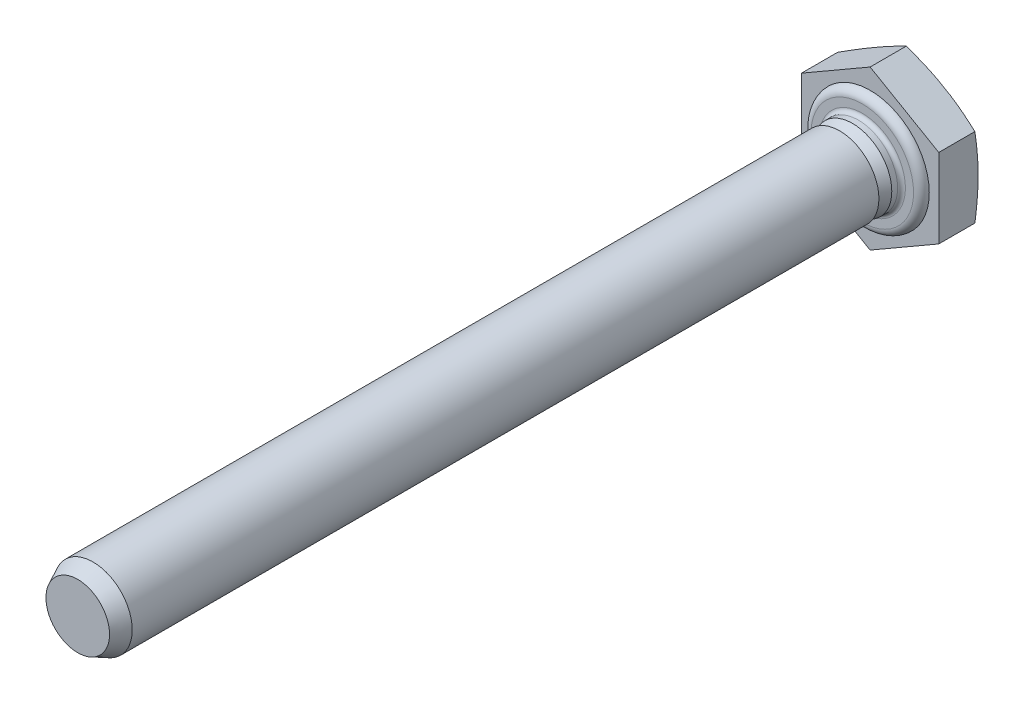
ISO-10303-21;
HEADER;
FILE_DESCRIPTION(('STEP AP214'),'2;1');
FILE_NAME('part.step','',(''),(''),'','','');
FILE_SCHEMA(('AUTOMOTIVE_DESIGN { 1 0 10303 214 1 1 1 1 }'));
ENDSEC;
DATA;
#1=APPLICATION_CONTEXT('core data for automotive mechanical design processes');
#2=APPLICATION_PROTOCOL_DEFINITION('international standard','automotive_design',2000,#1);
#3=PRODUCT_CONTEXT('',#1,'mechanical');
#4=PRODUCT('Part','Part','',(#3));
#5=PRODUCT_RELATED_PRODUCT_CATEGORY('part','',(#4));
#6=PRODUCT_DEFINITION_FORMATION('','',#4);
#7=PRODUCT_DEFINITION_CONTEXT('part definition',#1,'design');
#8=PRODUCT_DEFINITION('design','',#6,#7);
#9=PRODUCT_DEFINITION_SHAPE('','',#8);
#10=(LENGTH_UNIT() NAMED_UNIT(*) SI_UNIT(.MILLI.,.METRE.));
#11=(NAMED_UNIT(*) PLANE_ANGLE_UNIT() SI_UNIT($,.RADIAN.));
#12=(NAMED_UNIT(*) SI_UNIT($,.STERADIAN.) SOLID_ANGLE_UNIT());
#13=UNCERTAINTY_MEASURE_WITH_UNIT(LENGTH_MEASURE(1.E-05),#10,'distance_accuracy_value','');
#14=(GEOMETRIC_REPRESENTATION_CONTEXT(3) GLOBAL_UNCERTAINTY_ASSIGNED_CONTEXT((#13)) GLOBAL_UNIT_ASSIGNED_CONTEXT((#10,
#11,#12)) REPRESENTATION_CONTEXT('',''));
#15=CARTESIAN_POINT('',(0.,0.,0.));
#16=DIRECTION('',(0.,0.,1.));
#17=DIRECTION('',(1.,0.,0.));
#18=AXIS2_PLACEMENT_3D('',#15,#16,#17);
#19=CARTESIAN_POINT('',(0.,-1.621125,40.));
#20=DIRECTION('',(0.,0.,1.));
#21=DIRECTION('',(-1.,0.,0.));
#22=AXIS2_PLACEMENT_3D('',#19,#20,#21);
#23=PLANE('',#22);
#24=CARTESIAN_POINT('',(0.,0.,40.));
#25=DIRECTION('',(0.,0.,-1.));
#26=DIRECTION('',(1.,0.,0.));
#27=AXIS2_PLACEMENT_3D('',#24,#25,#26);
#28=CIRCLE('',#27,1.621125);
#29=CARTESIAN_POINT('',(1.621125,0.,40.));
#30=VERTEX_POINT('',#29);
#31=EDGE_CURVE('E9',#30,#30,#28,.T.);
#32=ORIENTED_EDGE('',*,*,#31,.F.);
#33=EDGE_LOOP('',(#32));
#34=FACE_BOUND('',#33,.T.);
#35=ADVANCED_FACE('F15',(#34),#23,.T.);
#36=CARTESIAN_POINT('',(0.,0.,39.221125));
#37=DIRECTION('',(0.,0.,-1.));
#38=DIRECTION('',(1.,0.,0.));
#39=AXIS2_PLACEMENT_3D('',#36,#37,#38);
#40=CONICAL_SURFACE('',#39,2.,0.452739889546849);
#41=ORIENTED_EDGE('',*,*,#31,.T.);
#42=EDGE_LOOP('',(#41));
#43=FACE_BOUND('',#42,.T.);
#44=CARTESIAN_POINT('',(0.,0.,39.221125));
#45=DIRECTION('',(0.,0.,-1.));
#46=DIRECTION('',(1.,0.,0.));
#47=AXIS2_PLACEMENT_3D('',#44,#45,#46);
#48=CIRCLE('',#47,2.);
#49=CARTESIAN_POINT('',(2.,0.,39.221125));
#50=VERTEX_POINT('',#49);
#51=EDGE_CURVE('E23',#50,#50,#48,.T.);
#52=ORIENTED_EDGE('',*,*,#51,.F.);
#53=EDGE_LOOP('',(#52));
#54=FACE_BOUND('',#53,.T.);
#55=ADVANCED_FACE('F239',(#43,#54),#40,.T.);
#56=CARTESIAN_POINT('',(0.,0.,-0.4));
#57=DIRECTION('',(0.,0.,-1.));
#58=DIRECTION('',(1.,0.,0.));
#59=AXIS2_PLACEMENT_3D('',#56,#57,#58);
#60=CYLINDRICAL_SURFACE('',#59,2.);
#61=ORIENTED_EDGE('',*,*,#51,.T.);
#62=EDGE_LOOP('',(#61));
#63=FACE_BOUND('',#62,.T.);
#64=CARTESIAN_POINT('',(0.,0.,1.152));
#65=DIRECTION('',(0.,0.,-1.));
#66=DIRECTION('',(1.,0.,0.));
#67=AXIS2_PLACEMENT_3D('',#64,#65,#66);
#68=CIRCLE('',#67,2.);
#69=CARTESIAN_POINT('',(2.,0.,1.152));
#70=VERTEX_POINT('',#69);
#71=EDGE_CURVE('E227',#70,#70,#68,.T.);
#72=ORIENTED_EDGE('',*,*,#71,.F.);
#73=EDGE_LOOP('',(#72));
#74=FACE_BOUND('',#73,.T.);
#75=ADVANCED_FACE('F236',(#63,#74),#60,.T.);
#76=CARTESIAN_POINT('',(0.,-1.621125,1.152));
#77=DIRECTION('',(0.,0.,-1.));
#78=DIRECTION('',(1.,0.,0.));
#79=AXIS2_PLACEMENT_3D('',#76,#77,#78);
#80=PLANE('',#79);
#81=ORIENTED_EDGE('',*,*,#71,.T.);
#82=EDGE_LOOP('',(#81));
#83=FACE_BOUND('',#82,.T.);
#84=CARTESIAN_POINT('',(0.,0.,1.152));
#85=DIRECTION('',(0.,0.,-1.));
#86=DIRECTION('',(1.,0.,0.));
#87=AXIS2_PLACEMENT_3D('',#84,#85,#86);
#88=CIRCLE('',#87,1.621125);
#89=CARTESIAN_POINT('',(1.621125,0.,1.152));
#90=VERTEX_POINT('',#89);
#91=EDGE_CURVE('E223',#90,#90,#88,.T.);
#92=ORIENTED_EDGE('',*,*,#91,.F.);
#93=EDGE_LOOP('',(#92));
#94=FACE_BOUND('',#93,.T.);
#95=ADVANCED_FACE('F247',(#83,#94),#80,.T.);
#96=CARTESIAN_POINT('',(0.,0.,0.495769250282342));
#97=DIRECTION('',(0.,0.,-1.));
#98=DIRECTION('',(1.,0.,0.));
#99=AXIS2_PLACEMENT_3D('',#96,#97,#98);
#100=CONICAL_SURFACE('',#99,2.,0.523598775598299);
#101=ORIENTED_EDGE('',*,*,#91,.T.);
#102=EDGE_LOOP('',(#101));
#103=FACE_BOUND('',#102,.T.);
#104=CARTESIAN_POINT('',(0.,0.,0.495769250282342));
#105=DIRECTION('',(0.,0.,-1.));
#106=DIRECTION('',(1.,0.,0.));
#107=AXIS2_PLACEMENT_3D('',#104,#105,#106);
#108=CIRCLE('',#107,2.);
#109=CARTESIAN_POINT('',(2.,0.,0.495769250282342));
#110=VERTEX_POINT('',#109);
#111=EDGE_CURVE('E219',#110,#110,#108,.T.);
#112=ORIENTED_EDGE('',*,*,#111,.F.);
#113=EDGE_LOOP('',(#112));
#114=FACE_BOUND('',#113,.T.);
#115=ADVANCED_FACE('F253',(#103,#114),#100,.T.);
#116=CARTESIAN_POINT('',(0.,0.,-0.4));
#117=DIRECTION('',(0.,0.,-1.));
#118=DIRECTION('',(1.,0.,0.));
#119=AXIS2_PLACEMENT_3D('',#116,#117,#118);
#120=CYLINDRICAL_SURFACE('',#119,2.);
#121=ORIENTED_EDGE('',*,*,#111,.T.);
#122=EDGE_LOOP('',(#121));
#123=FACE_BOUND('',#122,.T.);
#124=CARTESIAN_POINT('',(0.,0.,0.2));
#125=DIRECTION('',(0.,0.,-1.));
#126=DIRECTION('',(1.,0.,0.));
#127=AXIS2_PLACEMENT_3D('',#124,#125,#126);
#128=CIRCLE('',#127,2.);
#129=CARTESIAN_POINT('',(2.,0.,0.2));
#130=VERTEX_POINT('',#129);
#131=EDGE_CURVE('E215',#130,#130,#128,.T.);
#132=ORIENTED_EDGE('',*,*,#131,.F.);
#133=EDGE_LOOP('',(#132));
#134=FACE_BOUND('',#133,.T.);
#135=ADVANCED_FACE('F257',(#123,#134),#120,.T.);
#136=CARTESIAN_POINT('',(0.,0.,0.2));
#137=DIRECTION('',(0.,0.,-1.));
#138=DIRECTION('',(1.,0.,0.));
#139=AXIS2_PLACEMENT_3D('',#136,#137,#138);
#140=TOROIDAL_SURFACE('',#139,2.2,0.2);
#141=ORIENTED_EDGE('',*,*,#131,.T.);
#142=EDGE_LOOP('',(#141));
#143=FACE_BOUND('',#142,.T.);
#144=CARTESIAN_POINT('',(0.,0.,0.));
#145=DIRECTION('',(0.,0.,-1.));
#146=DIRECTION('',(1.,0.,0.));
#147=AXIS2_PLACEMENT_3D('',#144,#145,#146);
#148=CIRCLE('',#147,2.2);
#149=CARTESIAN_POINT('',(2.2,0.,0.));
#150=VERTEX_POINT('',#149);
#151=EDGE_CURVE('E211',#150,#150,#148,.T.);
#152=ORIENTED_EDGE('',*,*,#151,.F.);
#153=EDGE_LOOP('',(#152));
#154=FACE_BOUND('',#153,.T.);
#155=ADVANCED_FACE('F261',(#143,#154),#140,.F.);
#156=CARTESIAN_POINT('',(0.,-2.615,0.));
#157=DIRECTION('',(0.,0.,1.));
#158=DIRECTION('',(-1.,0.,0.));
#159=AXIS2_PLACEMENT_3D('',#156,#157,#158);
#160=PLANE('',#159);
#161=ORIENTED_EDGE('',*,*,#151,.T.);
#162=EDGE_LOOP('',(#161));
#163=FACE_BOUND('',#162,.T.);
#164=CARTESIAN_POINT('',(0.,0.,0.));
#165=DIRECTION('',(0.,0.,-1.));
#166=DIRECTION('',(1.,0.,0.));
#167=AXIS2_PLACEMENT_3D('',#164,#165,#166);
#168=CIRCLE('',#167,2.615);
#169=CARTESIAN_POINT('',(2.615,0.,0.));
#170=VERTEX_POINT('',#169);
#171=EDGE_CURVE('E207',#170,#170,#168,.T.);
#172=ORIENTED_EDGE('',*,*,#171,.F.);
#173=EDGE_LOOP('',(#172));
#174=FACE_BOUND('',#173,.T.);
#175=ADVANCED_FACE('F265',(#163,#174),#160,.T.);
#176=CARTESIAN_POINT('',(0.,0.,-0.4));
#177=DIRECTION('',(0.,0.,-1.));
#178=DIRECTION('',(1.,0.,0.));
#179=AXIS2_PLACEMENT_3D('',#176,#177,#178);
#180=TOROIDAL_SURFACE('',#179,2.615,0.4);
#181=CARTESIAN_POINT('',(0.,0.,-0.4));
#182=DIRECTION('',(0.,0.,-1.));
#183=DIRECTION('',(1.,0.,0.));
#184=AXIS2_PLACEMENT_3D('',#181,#182,#183);
#185=CIRCLE('',#184,3.015);
#186=CARTESIAN_POINT('',(3.015,0.,-0.4));
#187=VERTEX_POINT('',#186);
#188=EDGE_CURVE('E203',#187,#187,#185,.T.);
#189=ORIENTED_EDGE('',*,*,#188,.F.);
#190=EDGE_LOOP('',(#189));
#191=FACE_BOUND('',#190,.T.);
#192=ORIENTED_EDGE('',*,*,#171,.T.);
#193=EDGE_LOOP('',(#192));
#194=FACE_BOUND('',#193,.T.);
#195=ADVANCED_FACE('F269',(#191,#194),#180,.T.);
#196=CARTESIAN_POINT('',(-3.5,-2.02125,-0.4));
#197=DIRECTION('',(0.,0.,1.));
#198=DIRECTION('',(-1.,0.,0.));
#199=AXIS2_PLACEMENT_3D('',#196,#197,#198);
#200=PLANE('',#199);
#201=DIRECTION('',(0.,-1.,0.));
#202=VECTOR('',#201,1.);
#203=CARTESIAN_POINT('',(-3.5,2.02125,-0.4));
#204=LINE('',#203,#202);
#205=CARTESIAN_POINT('',(-3.5,2.02125,-0.4));
#206=VERTEX_POINT('',#205);
#207=CARTESIAN_POINT('',(-3.5,-2.02125,-0.4));
#208=VERTEX_POINT('',#207);
#209=EDGE_CURVE('E161',#206,#208,#204,.T.);
#210=ORIENTED_EDGE('',*,*,#209,.T.);
#211=DIRECTION('',(0.865969252911153,-0.500097243556191,0.));
#212=VECTOR('',#211,1.);
#213=CARTESIAN_POINT('',(-3.5,-2.02125,-0.4));
#214=LINE('',#213,#212);
#215=CARTESIAN_POINT('',(0.,-4.0425,-0.4));
#216=VERTEX_POINT('',#215);
#217=EDGE_CURVE('E163',#208,#216,#214,.T.);
#218=ORIENTED_EDGE('',*,*,#217,.T.);
#219=DIRECTION('',(0.865969252911153,0.500097243556191,0.));
#220=VECTOR('',#219,1.);
#221=CARTESIAN_POINT('',(0.,-4.0425,-0.4));
#222=LINE('',#221,#220);
#223=CARTESIAN_POINT('',(3.5,-2.02125,-0.4));
#224=VERTEX_POINT('',#223);
#225=EDGE_CURVE('E166',#216,#224,#222,.T.);
#226=ORIENTED_EDGE('',*,*,#225,.T.);
#227=DIRECTION('',(0.,1.,0.));
#228=VECTOR('',#227,1.);
#229=CARTESIAN_POINT('',(3.5,-2.02125,-0.4));
#230=LINE('',#229,#228);
#231=CARTESIAN_POINT('',(3.5,2.02125,-0.4));
#232=VERTEX_POINT('',#231);
#233=EDGE_CURVE('E169',#224,#232,#230,.T.);
#234=ORIENTED_EDGE('',*,*,#233,.T.);
#235=DIRECTION('',(-0.865969252911153,0.500097243556191,0.));
#236=VECTOR('',#235,1.);
#237=CARTESIAN_POINT('',(3.5,2.02125,-0.4));
#238=LINE('',#237,#236);
#239=CARTESIAN_POINT('',(0.,4.0425,-0.4));
#240=VERTEX_POINT('',#239);
#241=EDGE_CURVE('E172',#232,#240,#238,.T.);
#242=ORIENTED_EDGE('',*,*,#241,.T.);
#243=DIRECTION('',(-0.865969252911153,-0.500097243556191,0.));
#244=VECTOR('',#243,1.);
#245=CARTESIAN_POINT('',(0.,4.0425,-0.4));
#246=LINE('',#245,#244);
#247=EDGE_CURVE('E175',#240,#206,#246,.T.);
#248=ORIENTED_EDGE('',*,*,#247,.T.);
#249=EDGE_LOOP('',(#210,#218,#226,#234,#242,#248));
#250=FACE_BOUND('',#249,.T.);
#251=ORIENTED_EDGE('',*,*,#188,.T.);
#252=EDGE_LOOP('',(#251));
#253=FACE_BOUND('',#252,.T.);
#254=ADVANCED_FACE('F273',(#250,#253),#200,.T.);
#255=CARTESIAN_POINT('',(-3.5,2.02125,-0.4));
#256=DIRECTION('',(1.,0.,0.));
#257=DIRECTION('',(0.,0.,1.));
#258=AXIS2_PLACEMENT_3D('',#255,#256,#257);
#259=PLANE('',#258);
#260=DIRECTION('',(0.,0.,-1.));
#261=VECTOR('',#260,1.);
#262=CARTESIAN_POINT('',(-3.5,2.02125,-0.4));
#263=LINE('',#262,#261);
#264=CARTESIAN_POINT('',(-3.5,2.02125,-2.24006354118505));
#265=VERTEX_POINT('',#264);
#266=EDGE_CURVE('E178',#206,#265,#263,.T.);
#267=ORIENTED_EDGE('',*,*,#266,.T.);
#268=CARTESIAN_POINT('',(-3.5,5.3488604351927,-1.51685516034737));
#269=CARTESIAN_POINT('',(-3.5,5.1901334809816,-1.55771033626342));
#270=CARTESIAN_POINT('',(-3.5,5.03127797574728,-1.59807472901864));
#271=CARTESIAN_POINT('',(-3.5,4.71324571180039,-1.67755433073894));
#272=CARTESIAN_POINT('',(-3.5,4.55406893563082,-1.71666946976782));
#273=CARTESIAN_POINT('',(-3.5,4.23514159447463,-1.79342792637736));
#274=CARTESIAN_POINT('',(-3.5,4.07539055363853,-1.83106927491527));
#275=CARTESIAN_POINT('',(-3.5,3.75545564883947,-1.90446094500796));
#276=CARTESIAN_POINT('',(-3.5,3.5952717896129,-1.94021128716886));
#277=CARTESIAN_POINT('',(-3.5,3.27610705237593,-2.00899531505113));
#278=CARTESIAN_POINT('',(-3.5,3.11713160670768,-2.04205394501232));
#279=CARTESIAN_POINT('',(-3.5,2.7986140398166,-2.10531078946568));
#280=CARTESIAN_POINT('',(-3.5,2.63907190140448,-2.13550891640915));
#281=CARTESIAN_POINT('',(-3.5,2.15952944957669,-2.22080398148974));
#282=CARTESIAN_POINT('',(-3.5,1.83852497948265,-2.27062132514266));
#283=CARTESIAN_POINT('',(-3.5,1.35261807743886,-2.33003918376043));
#284=CARTESIAN_POINT('',(-3.5,1.18865846372142,-2.34736510986881));
#285=CARTESIAN_POINT('',(-3.5,0.860190119686767,-2.37575426839559));
#286=CARTESIAN_POINT('',(-3.5,0.695681407493685,-2.3868177055038));
#287=CARTESIAN_POINT('',(-3.5,0.366440728396435,-2.40201078206987));
#288=CARTESIAN_POINT('',(-3.5,0.20170896406224,-2.4061447310359));
#289=CARTESIAN_POINT('',(-3.5,-0.127778580974478,-2.40721534738604));
#290=CARTESIAN_POINT('',(-3.5,-0.292534361663439,-2.40415201881899));
#291=CARTESIAN_POINT('',(-3.5,-0.622551935412411,-2.3910026505355));
#292=CARTESIAN_POINT('',(-3.5,-0.787812359146802,-2.38088295800902));
#293=CARTESIAN_POINT('',(-3.5,-1.11780883528591,-2.35421492762463));
#294=CARTESIAN_POINT('',(-3.5,-1.28254487077088,-2.33766638441319));
#295=CARTESIAN_POINT('',(-3.5,-1.61150319670439,-2.29899947625407));
#296=CARTESIAN_POINT('',(-3.5,-1.77572488637315,-2.27687607791194));
#297=CARTESIAN_POINT('',(-3.5,-2.10346813873797,-2.22799486272768));
#298=CARTESIAN_POINT('',(-3.5,-2.26698969906591,-2.20123703022262));
#299=CARTESIAN_POINT('',(-3.5,-2.73266309718323,-2.11953462536887));
#300=CARTESIAN_POINT('',(-3.5,-3.03400993776105,-2.06002556986455));
#301=CARTESIAN_POINT('',(-3.5,-3.63489477991335,-1.93248977248264));
#302=CARTESIAN_POINT('',(-3.5,-3.9344324874207,-1.86446168295884));
#303=CARTESIAN_POINT('',(-3.5,-4.53222161454428,-1.72270275391119));
#304=CARTESIAN_POINT('',(-3.5,-4.83047270674187,-1.64897054387348));
#305=CARTESIAN_POINT('',(-3.5,-5.42595929913076,-1.49763199495027));
#306=CARTESIAN_POINT('',(-3.5,-5.72319487238417,-1.42002594132076));
#307=CARTESIAN_POINT('',(-3.5,-6.31308964580027,-1.26311448110605));
#308=CARTESIAN_POINT('',(-3.5,-6.60575821193297,-1.18384415628839));
#309=CARTESIAN_POINT('',(-3.5,-7.19057265545113,-1.02337751084096));
#310=CARTESIAN_POINT('',(-3.5,-7.48271852072608,-0.942181146192407));
#311=CARTESIAN_POINT('',(-3.5,-8.06617892623189,-0.778484827257806));
#312=CARTESIAN_POINT('',(-3.5,-8.35749405704399,-0.695986973591982));
#313=CARTESIAN_POINT('',(-3.5,-8.93979888292255,-0.529894976544645));
#314=CARTESIAN_POINT('',(-3.5,-9.23078859088742,-0.446300878415219));
#315=CARTESIAN_POINT('',(-3.5,-9.52166450301079,-0.362317231529198));
#316=B_SPLINE_CURVE_WITH_KNOTS('',3,(#268,#269,#270,#271,#272,#273,#274,#275,#276,#277,#278,
#279,#280,#281,#282,#283,#284,#285,#286,#287,#288,#289,#290,#291,#292,#293,#294,#295,#296,#297,
#298,#299,#300,#301,#302,#303,#304,#305,#306,#307,#308,#309,#310,#311,#312,#313,#314,#315),
.UNSPECIFIED.,.F.,.F.,(4,2,2,2,2,2,2,2,2,2,2,2,2,2,2,2,2,2,2,2,2,2,2,4),(0.,0.491704059994914,
0.983435598679787,1.47580312849893,1.96816529192506,2.45526698050728,2.94238357253472,
3.91634600186475,4.41086669666165,4.90537122708709,5.39956810664278,5.89376470818666,
6.39033446930134,6.88692009339614,7.38395568856989,7.88099296359977,8.80227509527502,
9.72370315129692,10.645353288099,11.5669356577118,12.4765685300994,13.3862222118088,
14.2945334630867,15.2028073372995),.UNSPECIFIED.);
#317=CARTESIAN_POINT('',(-3.5,0.392200705129954,-2.4));
#318=VERTEX_POINT('',#317);
#319=EDGE_CURVE('E140',#265,#318,#316,.T.);
#320=ORIENTED_EDGE('',*,*,#319,.T.);
#321=DIRECTION('',(0.,-1.,0.));
#322=VECTOR('',#321,1.);
#323=CARTESIAN_POINT('',(-3.5,2.02125,-2.4));
#324=LINE('',#323,#322);
#325=CARTESIAN_POINT('',(-3.5,-0.392200705129955,-2.4));
#326=VERTEX_POINT('',#325);
#327=EDGE_CURVE('E130',#318,#326,#324,.T.);
#328=ORIENTED_EDGE('',*,*,#327,.T.);
#329=CARTESIAN_POINT('',(-3.5,-2.02125,-2.24006354118505));
#330=VERTEX_POINT('',#329);
#331=EDGE_CURVE('E108',#326,#330,#316,.T.);
#332=ORIENTED_EDGE('',*,*,#331,.T.);
#333=DIRECTION('',(0.,0.,-1.));
#334=VECTOR('',#333,1.);
#335=CARTESIAN_POINT('',(-3.5,-2.02125,-0.4));
#336=LINE('',#335,#334);
#337=EDGE_CURVE('E115',#208,#330,#336,.T.);
#338=ORIENTED_EDGE('',*,*,#337,.F.);
#339=ORIENTED_EDGE('',*,*,#209,.F.);
#340=EDGE_LOOP('',(#267,#320,#328,#332,#338,#339));
#341=FACE_BOUND('',#340,.T.);
#342=ADVANCED_FACE('F275',(#341),#259,.F.);
#343=CARTESIAN_POINT('',(-3.5,-2.02125,-0.4));
#344=DIRECTION('',(0.500097243556191,0.865969252911153,0.));
#345=DIRECTION('',(-0.865969252911153,0.500097243556191,0.));
#346=AXIS2_PLACEMENT_3D('',#343,#344,#345);
#347=PLANE('',#346);
#348=ORIENTED_EDGE('',*,*,#337,.T.);
#349=CARTESIAN_POINT('',(-3.500002,-2.021248845,-2.24006318601753));
#350=CARTESIAN_POINT('',(-3.3827907951511,-2.08893831580024,-2.2608774043366));
#351=CARTESIAN_POINT('',(-3.26536355220382,-2.1567525486023,-2.28016212696227));
#352=CARTESIAN_POINT('',(-3.03021657496527,-2.29254992795756,-2.31513158850531));
#353=CARTESIAN_POINT('',(-2.91249719639175,-2.36053286908377,-2.33081953307972));
#354=CARTESIAN_POINT('',(-2.67667488596115,-2.49672025335744,-2.35809597220863));
#355=CARTESIAN_POINT('',(-2.5585718901785,-2.56492473342192,-2.36968374397391));
#356=CARTESIAN_POINT('',(-2.32199446100164,-2.70154819877155,-2.38834343332547));
#357=CARTESIAN_POINT('',(-2.20351978978409,-2.76996732139969,-2.39541130021978));
#358=CARTESIAN_POINT('',(-2.08496084141342,-2.83843511408375,-2.400002));
#359=B_SPLINE_CURVE_WITH_KNOTS('',3,(#349,#350,#351,#352,#353,#354,#355,#356,#357,#358),
.UNSPECIFIED.,.F.,.F.,(4,2,2,2,4),(0.,0.410843033009391,0.821318462999757,1.23186621666674,
1.64278138526766),.UNSPECIFIED.);
#360=CARTESIAN_POINT('',(-2.08501219419092,-2.83840545785474,-2.4));
#361=VERTEX_POINT('',#360);
#362=EDGE_CURVE('E106',#330,#361,#359,.T.);
#363=ORIENTED_EDGE('',*,*,#362,.T.);
#364=DIRECTION('',(0.865969252911153,-0.500097243556191,0.));
#365=VECTOR('',#364,1.);
#366=CARTESIAN_POINT('',(-3.5,-2.02125,-2.4));
#367=LINE('',#366,#365);
#368=CARTESIAN_POINT('',(-1.41634934798408,-3.22455825153919,-2.4));
#369=VERTEX_POINT('',#368);
#370=EDGE_CURVE('E122',#361,#369,#367,.T.);
#371=ORIENTED_EDGE('',*,*,#370,.T.);
#372=CARTESIAN_POINT('',(-1.41640070076157,-3.2245285953102,-2.400002));
#373=CARTESIAN_POINT('',(-1.29772681498736,-3.2930627643448,-2.39540691595689));
#374=CARTESIAN_POINT('',(-1.17913739968787,-3.36154815168026,-2.38832977609456));
#375=CARTESIAN_POINT('',(-0.942331358140242,-3.49830364067401,-2.36964316794344));
#376=CARTESIAN_POINT('',(-0.8241144931643,-3.56657388019762,-2.35803776387308));
#377=CARTESIAN_POINT('',(-0.588065368071718,-3.70289224993858,-2.33071907533163));
#378=CARTESIAN_POINT('',(-0.470233043693961,-3.77094041726674,-2.31500651699555));
#379=CARTESIAN_POINT('',(-0.234860755951052,-3.90686791343827,-2.27998236582985));
#380=CARTESIAN_POINT('',(-0.117321149585182,-3.97474703611456,-2.26066755771633));
#381=CARTESIAN_POINT('',(1.99999999983532E-06,-4.042501155,-2.23982132755722));
#382=B_SPLINE_CURVE_WITH_KNOTS('',3,(#372,#373,#374,#375,#376,#377,#378,#379,#380,#381),
.UNSPECIFIED.,.F.,.F.,(4,2,2,2,4),(0.,0.411313414061384,0.822258511167226,1.23313100325125,
1.6443720010649),.UNSPECIFIED.);
#383=CARTESIAN_POINT('',(0.,-4.0425,-2.23982168293207));
#384=VERTEX_POINT('',#383);
#385=EDGE_CURVE('E30',#369,#384,#382,.T.);
#386=ORIENTED_EDGE('',*,*,#385,.T.);
#387=DIRECTION('',(0.,0.,-1.));
#388=VECTOR('',#387,1.);
#389=CARTESIAN_POINT('',(0.,-4.0425,-0.4));
#390=LINE('',#389,#388);
#391=EDGE_CURVE('E197',#216,#384,#390,.T.);
#392=ORIENTED_EDGE('',*,*,#391,.F.);
#393=ORIENTED_EDGE('',*,*,#217,.F.);
#394=EDGE_LOOP('',(#348,#363,#371,#386,#392,#393));
#395=FACE_BOUND('',#394,.T.);
#396=ADVANCED_FACE('F121',(#395),#347,.F.);
#397=CARTESIAN_POINT('',(0.,-4.0425,-0.4));
#398=DIRECTION('',(-0.500097243556191,0.865969252911153,0.));
#399=DIRECTION('',(-0.865969252911153,-0.500097243556191,0.));
#400=AXIS2_PLACEMENT_3D('',#397,#398,#399);
#401=PLANE('',#400);
#402=ORIENTED_EDGE('',*,*,#391,.T.);
#403=CARTESIAN_POINT('',(-2.0000000004417E-06,-4.042501155,-2.23982132755722));
#404=CARTESIAN_POINT('',(0.117321149585182,-3.97474703611456,-2.26066755771633));
#405=CARTESIAN_POINT('',(0.234860755951053,-3.90686791343827,-2.27998236582985));
#406=CARTESIAN_POINT('',(0.470233043693963,-3.77094041726674,-2.31500651699555));
#407=CARTESIAN_POINT('',(0.588065368071721,-3.70289224993858,-2.33071907533163));
#408=CARTESIAN_POINT('',(0.824114493164304,-3.56657388019761,-2.35803776387308));
#409=CARTESIAN_POINT('',(0.942331358140246,-3.49830364067401,-2.36964316794344));
#410=CARTESIAN_POINT('',(1.17913739968788,-3.36154815168025,-2.38832977609456));
#411=CARTESIAN_POINT('',(1.29772681498737,-3.29306276434479,-2.39540691595689));
#412=CARTESIAN_POINT('',(1.41640070076158,-3.22452859531019,-2.400002));
#413=B_SPLINE_CURVE_WITH_KNOTS('',3,(#403,#404,#405,#406,#407,#408,#409,#410,#411,#412),
.UNSPECIFIED.,.F.,.F.,(4,2,2,2,4),(0.,0.411240997813655,0.822113489897677,1.23305858700352,
1.64437200106491),.UNSPECIFIED.);
#414=CARTESIAN_POINT('',(1.41634934798408,-3.22455825153919,-2.4));
#415=VERTEX_POINT('',#414);
#416=EDGE_CURVE('E288',#384,#415,#413,.T.);
#417=ORIENTED_EDGE('',*,*,#416,.T.);
#418=DIRECTION('',(0.865969252911153,0.500097243556191,0.));
#419=VECTOR('',#418,1.);
#420=CARTESIAN_POINT('',(0.,-4.0425,-2.4));
#421=LINE('',#420,#419);
#422=CARTESIAN_POINT('',(2.08501219419091,-2.83840545785475,-2.4));
#423=VERTEX_POINT('',#422);
#424=EDGE_CURVE('E129',#415,#423,#421,.T.);
#425=ORIENTED_EDGE('',*,*,#424,.T.);
#426=CARTESIAN_POINT('',(2.08496084141342,-2.83843511408375,-2.400002));
#427=CARTESIAN_POINT('',(2.20351978978409,-2.76996732139969,-2.39541130021978));
#428=CARTESIAN_POINT('',(2.32199446100164,-2.70154819877155,-2.38834343332547));
#429=CARTESIAN_POINT('',(2.5585718901785,-2.56492473342192,-2.36968374397391));
#430=CARTESIAN_POINT('',(2.67667488596115,-2.49672025335744,-2.35809597220863));
#431=CARTESIAN_POINT('',(2.91249719639175,-2.36053286908377,-2.33081953307973));
#432=CARTESIAN_POINT('',(3.03021657496527,-2.29254992795756,-2.31513158850531));
#433=CARTESIAN_POINT('',(3.26536355220381,-2.1567525486023,-2.28016212696227));
#434=CARTESIAN_POINT('',(3.3827907951511,-2.08893831580024,-2.2608774043366));
#435=CARTESIAN_POINT('',(3.500002,-2.021248845,-2.24006318601753));
#436=B_SPLINE_CURVE_WITH_KNOTS('',3,(#426,#427,#428,#429,#430,#431,#432,#433,#434,#435),
.UNSPECIFIED.,.F.,.F.,(4,2,2,2,4),(0.,0.410915168600916,0.821462922267904,1.23193835225827,
1.64278138526766),.UNSPECIFIED.);
#437=CARTESIAN_POINT('',(3.5,-2.02125,-2.24006354118505));
#438=VERTEX_POINT('',#437);
#439=EDGE_CURVE('E38',#423,#438,#436,.T.);
#440=ORIENTED_EDGE('',*,*,#439,.T.);
#441=DIRECTION('',(0.,0.,-1.));
#442=VECTOR('',#441,1.);
#443=CARTESIAN_POINT('',(3.5,-2.02125,-0.4));
#444=LINE('',#443,#442);
#445=EDGE_CURVE('E193',#224,#438,#444,.T.);
#446=ORIENTED_EDGE('',*,*,#445,.F.);
#447=ORIENTED_EDGE('',*,*,#225,.F.);
#448=EDGE_LOOP('',(#402,#417,#425,#440,#446,#447));
#449=FACE_BOUND('',#448,.T.);
#450=ADVANCED_FACE('F352',(#449),#401,.F.);
#451=CARTESIAN_POINT('',(3.5,-2.02125,-0.4));
#452=DIRECTION('',(-1.,0.,0.));
#453=DIRECTION('',(0.,0.,-1.));
#454=AXIS2_PLACEMENT_3D('',#451,#452,#453);
#455=PLANE('',#454);
#456=ORIENTED_EDGE('',*,*,#445,.T.);
#457=CARTESIAN_POINT('',(3.5,5.34886045272993,-1.51685515583218));
#458=CARTESIAN_POINT('',(3.5,5.19013349781647,-1.55771033196912));
#459=CARTESIAN_POINT('',(3.5,5.03127799187948,-1.59807472494449));
#460=CARTESIAN_POINT('',(3.5,4.71324572652607,-1.67755432710199));
#461=CARTESIAN_POINT('',(3.5,4.55406894965266,-1.71666946634792));
#462=CARTESIAN_POINT('',(3.5,4.23514160708411,-1.79342792338765));
#463=CARTESIAN_POINT('',(3.5,4.07539056553948,-1.83106927213868));
#464=CARTESIAN_POINT('',(3.5,3.75545565932112,-1.90446094265012));
#465=CARTESIAN_POINT('',(3.5,3.59527179938376,-1.94021128501667));
#466=CARTESIAN_POINT('',(3.5,3.27610706074698,-2.00899531329304));
#467=CARTESIAN_POINT('',(3.5,3.1171316143898,-2.04205394344304));
#468=CARTESIAN_POINT('',(3.5,2.79861404611691,-2.10531078825801));
#469=CARTESIAN_POINT('',(3.5,2.63907190701193,-2.13550891537428));
#470=CARTESIAN_POINT('',(3.5,2.15952945309904,-2.22080398093847));
#471=CARTESIAN_POINT('',(3.5,1.83852498160459,-2.27062132486781));
#472=CARTESIAN_POINT('',(3.5,1.35261807734071,-2.33003918378021));
#473=CARTESIAN_POINT('',(3.5,1.18865846281182,-2.34736510996943));
#474=CARTESIAN_POINT('',(3.5,0.860190117149437,-2.37575426859289));
#475=CARTESIAN_POINT('',(3.5,0.695681404140076,-2.38681770571695));
#476=CARTESIAN_POINT('',(3.5,0.366440723410655,-2.40201078224164));
#477=CARTESIAN_POINT('',(3.5,0.20170895826057,-2.40614473115054));
#478=CARTESIAN_POINT('',(3.5,-0.127778588403958,-2.4072153473144));
#479=CARTESIAN_POINT('',(3.5,-0.292534369904838,-2.40415201861822));
#480=CARTESIAN_POINT('',(3.5,-0.62255194527725,-2.39100265001414));
#481=CARTESIAN_POINT('',(3.5,-0.787812369823112,-2.38088295729576));
#482=CARTESIAN_POINT('',(3.5,-1.11780884757554,-2.35421492648179));
#483=CARTESIAN_POINT('',(3.5,-1.28254488386236,-2.33766638303268));
#484=CARTESIAN_POINT('',(3.5,-1.61150321139349,-2.29899947436879));
#485=CARTESIAN_POINT('',(3.5,-1.77572490185802,-2.27687607575946));
#486=CARTESIAN_POINT('',(3.5,-2.10346815580746,-2.22799486002503));
#487=CARTESIAN_POINT('',(3.5,-2.26698971692425,-2.201237027237));
#488=CARTESIAN_POINT('',(3.5,-2.73266311578358,-2.11953462183004));
#489=CARTESIAN_POINT('',(3.5,-3.03400995632021,-2.06002556611146));
#490=CARTESIAN_POINT('',(3.5,-3.63489479840001,-1.93248976837338));
#491=CARTESIAN_POINT('',(3.5,-3.93443250587606,-1.86446167870772));
#492=CARTESIAN_POINT('',(3.5,-4.53222163293786,-1.72270274942423));
#493=CARTESIAN_POINT('',(3.5,-4.830472725105,-1.6489705392927));
#494=CARTESIAN_POINT('',(3.5,-5.42595931743994,-1.49763199021128));
#495=CARTESIAN_POINT('',(3.5,-5.72319489066982,-1.42002593651737));
#496=CARTESIAN_POINT('',(3.5,-6.31308966401444,-1.26311447620144));
#497=CARTESIAN_POINT('',(3.5,-6.60575823009919,-1.18384415134697));
#498=CARTESIAN_POINT('',(3.5,-7.19057267352456,-1.02337750583872));
#499=CARTESIAN_POINT('',(3.5,-7.48271853875468,-0.94218114116616));
#500=CARTESIAN_POINT('',(3.5,-8.06617894418693,-0.77848482218837));
#501=CARTESIAN_POINT('',(3.5,-8.35749407497028,-0.695986968503292));
#502=CARTESIAN_POINT('',(3.5,-8.93979890079322,-0.529894971423545));
#503=CARTESIAN_POINT('',(3.5,-9.2307886087312,-0.446300873280962));
#504=CARTESIAN_POINT('',(3.5,-9.52166452082823,-0.36231722638368));
#505=B_SPLINE_CURVE_WITH_KNOTS('',3,(#457,#458,#459,#460,#461,#462,#463,#464,#465,#466,#467,
#468,#469,#470,#471,#472,#473,#474,#475,#476,#477,#478,#479,#480,#481,#482,#483,#484,#485,#486,
#487,#488,#489,#490,#491,#492,#493,#494,#495,#496,#497,#498,#499,#500,#501,#502,#503,#504),
.UNSPECIFIED.,.F.,.F.,(4,2,2,2,2,2,2,2,2,2,2,2,2,2,2,2,2,2,2,2,2,2,2,4),(0.,0.491704062200663,
0.983435603091438,1.4758031351261,1.96816530076773,2.45526699148858,2.94238358565485,
3.9163460192572,4.41086671649894,4.9053712493687,5.39956813136456,5.89376473534879,
6.39033449892696,6.8869201254857,7.3839557231321,7.88099300063454,8.8022751323168,
9.7237031883425,10.645353325124,11.5669356947177,12.4765685669954,13.3862222485946,
14.2945334998053,15.2028073739514),.UNSPECIFIED.);
#506=CARTESIAN_POINT('',(3.5,-0.392200705129944,-2.4));
#507=VERTEX_POINT('',#506);
#508=EDGE_CURVE('E314',#438,#507,#505,.F.);
#509=ORIENTED_EDGE('',*,*,#508,.T.);
#510=DIRECTION('',(0.,1.,0.));
#511=VECTOR('',#510,1.);
#512=CARTESIAN_POINT('',(3.5,-2.02125,-2.4));
#513=LINE('',#512,#511);
#514=CARTESIAN_POINT('',(3.5,0.392200705129943,-2.4));
#515=VERTEX_POINT('',#514);
#516=EDGE_CURVE('E137',#507,#515,#513,.T.);
#517=ORIENTED_EDGE('',*,*,#516,.T.);
#518=CARTESIAN_POINT('',(3.5,2.02125,-2.24006354118505));
#519=VERTEX_POINT('',#518);
#520=EDGE_CURVE('E368',#515,#519,#505,.F.);
#521=ORIENTED_EDGE('',*,*,#520,.T.);
#522=DIRECTION('',(0.,0.,-1.));
#523=VECTOR('',#522,1.);
#524=CARTESIAN_POINT('',(3.5,2.02125,-0.4));
#525=LINE('',#524,#523);
#526=EDGE_CURVE('E189',#232,#519,#525,.T.);
#527=ORIENTED_EDGE('',*,*,#526,.F.);
#528=ORIENTED_EDGE('',*,*,#233,.F.);
#529=EDGE_LOOP('',(#456,#509,#517,#521,#527,#528));
#530=FACE_BOUND('',#529,.T.);
#531=ADVANCED_FACE('F346',(#530),#455,.F.);
#532=CARTESIAN_POINT('',(3.5,2.02125,-0.4));
#533=DIRECTION('',(-0.500097243556191,-0.865969252911153,0.));
#534=DIRECTION('',(0.865969252911153,-0.500097243556191,0.));
#535=AXIS2_PLACEMENT_3D('',#532,#533,#534);
#536=PLANE('',#535);
#537=ORIENTED_EDGE('',*,*,#526,.T.);
#538=CARTESIAN_POINT('',(3.500002,2.021248845,-2.24006318601753));
#539=CARTESIAN_POINT('',(3.3827907951511,2.08893831580024,-2.2608774043366));
#540=CARTESIAN_POINT('',(3.26536355220381,2.1567525486023,-2.28016212696227));
#541=CARTESIAN_POINT('',(3.03021657496527,2.29254992795756,-2.31513158850531));
#542=CARTESIAN_POINT('',(2.91249719639175,2.36053286908377,-2.33081953307973));
#543=CARTESIAN_POINT('',(2.67667488596115,2.49672025335744,-2.35809597220863));
#544=CARTESIAN_POINT('',(2.5585718901785,2.56492473342192,-2.36968374397392));
#545=CARTESIAN_POINT('',(2.32199446100164,2.70154819877155,-2.38834343332547));
#546=CARTESIAN_POINT('',(2.20351978978409,2.76996732139969,-2.39541130021978));
#547=CARTESIAN_POINT('',(2.08496084141342,2.83843511408375,-2.400002));
#548=B_SPLINE_CURVE_WITH_KNOTS('',3,(#538,#539,#540,#541,#542,#543,#544,#545,#546,#547),
.UNSPECIFIED.,.F.,.F.,(4,2,2,2,4),(0.,0.410843033009392,0.821318462999759,1.23186621666675,
1.64278138526766),.UNSPECIFIED.);
#549=CARTESIAN_POINT('',(2.08501219419091,2.83840545785475,-2.4));
#550=VERTEX_POINT('',#549);
#551=EDGE_CURVE('E326',#519,#550,#548,.T.);
#552=ORIENTED_EDGE('',*,*,#551,.T.);
#553=DIRECTION('',(-0.865969252911153,0.500097243556191,0.));
#554=VECTOR('',#553,1.);
#555=CARTESIAN_POINT('',(3.5,2.02125,-2.4));
#556=LINE('',#555,#554);
#557=CARTESIAN_POINT('',(1.41634934798408,3.22455825153919,-2.4));
#558=VERTEX_POINT('',#557);
#559=EDGE_CURVE('E154',#550,#558,#556,.T.);
#560=ORIENTED_EDGE('',*,*,#559,.T.);
#561=CARTESIAN_POINT('',(1.41640070076158,3.22452859531019,-2.400002));
#562=CARTESIAN_POINT('',(1.29772681498737,3.29306276434479,-2.39540691595689));
#563=CARTESIAN_POINT('',(1.17913739968788,3.36154815168025,-2.38832977609456));
#564=CARTESIAN_POINT('',(0.942331358140246,3.49830364067401,-2.36964316794344));
#565=CARTESIAN_POINT('',(0.824114493164304,3.56657388019761,-2.35803776387308));
#566=CARTESIAN_POINT('',(0.588065368071721,3.70289224993858,-2.33071907533163));
#567=CARTESIAN_POINT('',(0.470233043693963,3.77094041726674,-2.31500651699555));
#568=CARTESIAN_POINT('',(0.234860755951053,3.90686791343827,-2.27998236582985));
#569=CARTESIAN_POINT('',(0.117321149585183,3.97474703611456,-2.26066755771633));
#570=CARTESIAN_POINT('',(-1.99999999904323E-06,4.042501155,-2.23982132755722));
#571=B_SPLINE_CURVE_WITH_KNOTS('',3,(#561,#562,#563,#564,#565,#566,#567,#568,#569,#570),
.UNSPECIFIED.,.F.,.F.,(4,2,2,2,4),(0.,0.411313414061386,0.822258511167229,1.23313100325125,
1.6443720010649),.UNSPECIFIED.);
#572=CARTESIAN_POINT('',(0.,4.0425,-2.23982168293207));
#573=VERTEX_POINT('',#572);
#574=EDGE_CURVE('E336',#558,#573,#571,.T.);
#575=ORIENTED_EDGE('',*,*,#574,.T.);
#576=DIRECTION('',(0.,0.,-1.));
#577=VECTOR('',#576,1.);
#578=CARTESIAN_POINT('',(0.,4.0425,-0.4));
#579=LINE('',#578,#577);
#580=EDGE_CURVE('E185',#240,#573,#579,.T.);
#581=ORIENTED_EDGE('',*,*,#580,.F.);
#582=ORIENTED_EDGE('',*,*,#241,.F.);
#583=EDGE_LOOP('',(#537,#552,#560,#575,#581,#582));
#584=FACE_BOUND('',#583,.T.);
#585=ADVANCED_FACE('F342',(#584),#536,.F.);
#586=CARTESIAN_POINT('',(0.,4.0425,-0.4));
#587=DIRECTION('',(0.500097243556191,-0.865969252911153,0.));
#588=DIRECTION('',(0.865969252911153,0.500097243556191,0.));
#589=AXIS2_PLACEMENT_3D('',#586,#587,#588);
#590=PLANE('',#589);
#591=ORIENTED_EDGE('',*,*,#580,.T.);
#592=CARTESIAN_POINT('',(2.00000000079563E-06,4.042501155,-2.23982132755722));
#593=CARTESIAN_POINT('',(-0.117321149585181,3.97474703611456,-2.26066755771633));
#594=CARTESIAN_POINT('',(-0.234860755951052,3.90686791343827,-2.27998236582985));
#595=CARTESIAN_POINT('',(-0.470233043693961,3.77094041726674,-2.31500651699555));
#596=CARTESIAN_POINT('',(-0.588065368071719,3.70289224993858,-2.33071907533163));
#597=CARTESIAN_POINT('',(-0.824114493164301,3.56657388019762,-2.35803776387308));
#598=CARTESIAN_POINT('',(-0.942331358140243,3.49830364067401,-2.36964316794344));
#599=CARTESIAN_POINT('',(-1.17913739968787,3.36154815168025,-2.38832977609456));
#600=CARTESIAN_POINT('',(-1.29772681498737,3.2930627643448,-2.39540691595689));
#601=CARTESIAN_POINT('',(-1.41640070076157,3.22452859531019,-2.400002));
#602=B_SPLINE_CURVE_WITH_KNOTS('',3,(#592,#593,#594,#595,#596,#597,#598,#599,#600,#601),
.UNSPECIFIED.,.F.,.F.,(4,2,2,2,4),(0.,0.411240997813653,0.822113489897674,1.23305858700352,
1.6443720010649),.UNSPECIFIED.);
#603=CARTESIAN_POINT('',(-1.41634934798408,3.22455825153919,-2.4));
#604=VERTEX_POINT('',#603);
#605=EDGE_CURVE('E332',#573,#604,#602,.T.);
#606=ORIENTED_EDGE('',*,*,#605,.T.);
#607=DIRECTION('',(-0.865969252911153,-0.500097243556191,0.));
#608=VECTOR('',#607,1.);
#609=CARTESIAN_POINT('',(0.,4.0425,-2.4));
#610=LINE('',#609,#608);
#611=CARTESIAN_POINT('',(-2.08501219419092,2.83840545785474,-2.4));
#612=VERTEX_POINT('',#611);
#613=EDGE_CURVE('E158',#604,#612,#610,.T.);
#614=ORIENTED_EDGE('',*,*,#613,.T.);
#615=CARTESIAN_POINT('',(-2.08496084141343,2.83843511408374,-2.400002));
#616=CARTESIAN_POINT('',(-2.2035197897841,2.76996732139968,-2.39541130021978));
#617=CARTESIAN_POINT('',(-2.32199446100165,2.70154819877155,-2.38834343332547));
#618=CARTESIAN_POINT('',(-2.5585718901785,2.56492473342191,-2.36968374397391));
#619=CARTESIAN_POINT('',(-2.67667488596115,2.49672025335743,-2.35809597220863));
#620=CARTESIAN_POINT('',(-2.91249719639175,2.36053286908376,-2.33081953307973));
#621=CARTESIAN_POINT('',(-3.03021657496527,2.29254992795755,-2.31513158850531));
#622=CARTESIAN_POINT('',(-3.26536355220382,2.1567525486023,-2.28016212696227));
#623=CARTESIAN_POINT('',(-3.3827907951511,2.08893831580024,-2.2608774043366));
#624=CARTESIAN_POINT('',(-3.500002,2.021248845,-2.24006318601753));
#625=B_SPLINE_CURVE_WITH_KNOTS('',3,(#615,#616,#617,#618,#619,#620,#621,#622,#623,#624),
.UNSPECIFIED.,.F.,.F.,(4,2,2,2,4),(0.,0.410915168600914,0.821462922267898,1.23193835225826,
1.64278138526765),.UNSPECIFIED.);
#626=EDGE_CURVE('E143',#612,#265,#625,.T.);
#627=ORIENTED_EDGE('',*,*,#626,.T.);
#628=ORIENTED_EDGE('',*,*,#266,.F.);
#629=ORIENTED_EDGE('',*,*,#247,.F.);
#630=EDGE_LOOP('',(#591,#606,#614,#627,#628,#629));
#631=FACE_BOUND('',#630,.T.);
#632=ADVANCED_FACE('F345',(#631),#590,.F.);
#633=CARTESIAN_POINT('',(-3.5,-2.02125,-2.4));
#634=DIRECTION('',(0.,0.,1.));
#635=DIRECTION('',(-1.,0.,0.));
#636=AXIS2_PLACEMENT_3D('',#633,#634,#635);
#637=PLANE('',#636);
#638=ORIENTED_EDGE('',*,*,#327,.F.);
#639=CARTESIAN_POINT('',(0.,0.,-2.4));
#640=DIRECTION('',(0.,0.,1.));
#641=DIRECTION('',(-1.,0.,0.));
#642=AXIS2_PLACEMENT_3D('',#639,#640,#641);
#643=CIRCLE('',#642,3.52190593189319);
#644=EDGE_CURVE('E117',#318,#612,#643,.F.);
#645=ORIENTED_EDGE('',*,*,#644,.T.);
#646=ORIENTED_EDGE('',*,*,#613,.F.);
#647=EDGE_CURVE('E427',#604,#558,#643,.F.);
#648=ORIENTED_EDGE('',*,*,#647,.T.);
#649=ORIENTED_EDGE('',*,*,#559,.F.);
#650=EDGE_CURVE('E431',#550,#515,#643,.F.);
#651=ORIENTED_EDGE('',*,*,#650,.T.);
#652=ORIENTED_EDGE('',*,*,#516,.F.);
#653=EDGE_CURVE('E435',#507,#423,#643,.F.);
#654=ORIENTED_EDGE('',*,*,#653,.T.);
#655=ORIENTED_EDGE('',*,*,#424,.F.);
#656=EDGE_CURVE('E114',#415,#369,#643,.F.);
#657=ORIENTED_EDGE('',*,*,#656,.T.);
#658=ORIENTED_EDGE('',*,*,#370,.F.);
#659=EDGE_CURVE('E103',#361,#326,#643,.F.);
#660=ORIENTED_EDGE('',*,*,#659,.T.);
#661=EDGE_LOOP('',(#638,#645,#646,#648,#649,#651,#652,#654,#655,#657,#658,#660));
#662=FACE_BOUND('',#661,.T.);
#663=ADVANCED_FACE('F126',(#662),#637,.F.);
#664=CARTESIAN_POINT('',(0.,0.,-2.21494545454545));
#665=DIRECTION('',(0.,0.,1.));
#666=DIRECTION('',(-1.,0.,0.));
#667=AXIS2_PLACEMENT_3D('',#664,#665,#666);
#668=CONICAL_SURFACE('',#667,4.12335,1.27230524444207);
#669=ORIENTED_EDGE('',*,*,#659,.F.);
#670=ORIENTED_EDGE('',*,*,#362,.F.);
#671=ORIENTED_EDGE('',*,*,#331,.F.);
#672=EDGE_LOOP('',(#669,#670,#671));
#673=FACE_BOUND('',#672,.T.);
#674=ADVANCED_FACE('F105',(#673),#668,.T.);
#675=ORIENTED_EDGE('',*,*,#656,.F.);
#676=ORIENTED_EDGE('',*,*,#416,.F.);
#677=ORIENTED_EDGE('',*,*,#385,.F.);
#678=EDGE_LOOP('',(#675,#676,#677));
#679=FACE_BOUND('',#678,.T.);
#680=ADVANCED_FACE('F444',(#679),#668,.T.);
#681=ORIENTED_EDGE('',*,*,#653,.F.);
#682=ORIENTED_EDGE('',*,*,#508,.F.);
#683=ORIENTED_EDGE('',*,*,#439,.F.);
#684=EDGE_LOOP('',(#681,#682,#683));
#685=FACE_BOUND('',#684,.T.);
#686=ADVANCED_FACE('F451',(#685),#668,.T.);
#687=ORIENTED_EDGE('',*,*,#650,.F.);
#688=ORIENTED_EDGE('',*,*,#551,.F.);
#689=ORIENTED_EDGE('',*,*,#520,.F.);
#690=EDGE_LOOP('',(#687,#688,#689));
#691=FACE_BOUND('',#690,.T.);
#692=ADVANCED_FACE('F458',(#691),#668,.T.);
#693=ORIENTED_EDGE('',*,*,#647,.F.);
#694=ORIENTED_EDGE('',*,*,#605,.F.);
#695=ORIENTED_EDGE('',*,*,#574,.F.);
#696=EDGE_LOOP('',(#693,#694,#695));
#697=FACE_BOUND('',#696,.T.);
#698=ADVANCED_FACE('F300',(#697),#668,.T.);
#699=ORIENTED_EDGE('',*,*,#626,.F.);
#700=ORIENTED_EDGE('',*,*,#644,.F.);
#701=ORIENTED_EDGE('',*,*,#319,.F.);
#702=EDGE_LOOP('',(#699,#700,#701));
#703=FACE_BOUND('',#702,.T.);
#704=ADVANCED_FACE('F296',(#703),#668,.T.);
#705=CLOSED_SHELL('',(#35,#55,#75,#95,#115,#135,#155,#175,#195,#254,#342,#396,#450,#531,#585,
#632,#663,#674,#680,#686,#692,#698,#704));
#706=MANIFOLD_SOLID_BREP('B1',#705);
#707=ADVANCED_BREP_SHAPE_REPRESENTATION('',(#18,#706),#14);
#708=SHAPE_DEFINITION_REPRESENTATION(#9,#707);
ENDSEC;
END-ISO-10303-21;
